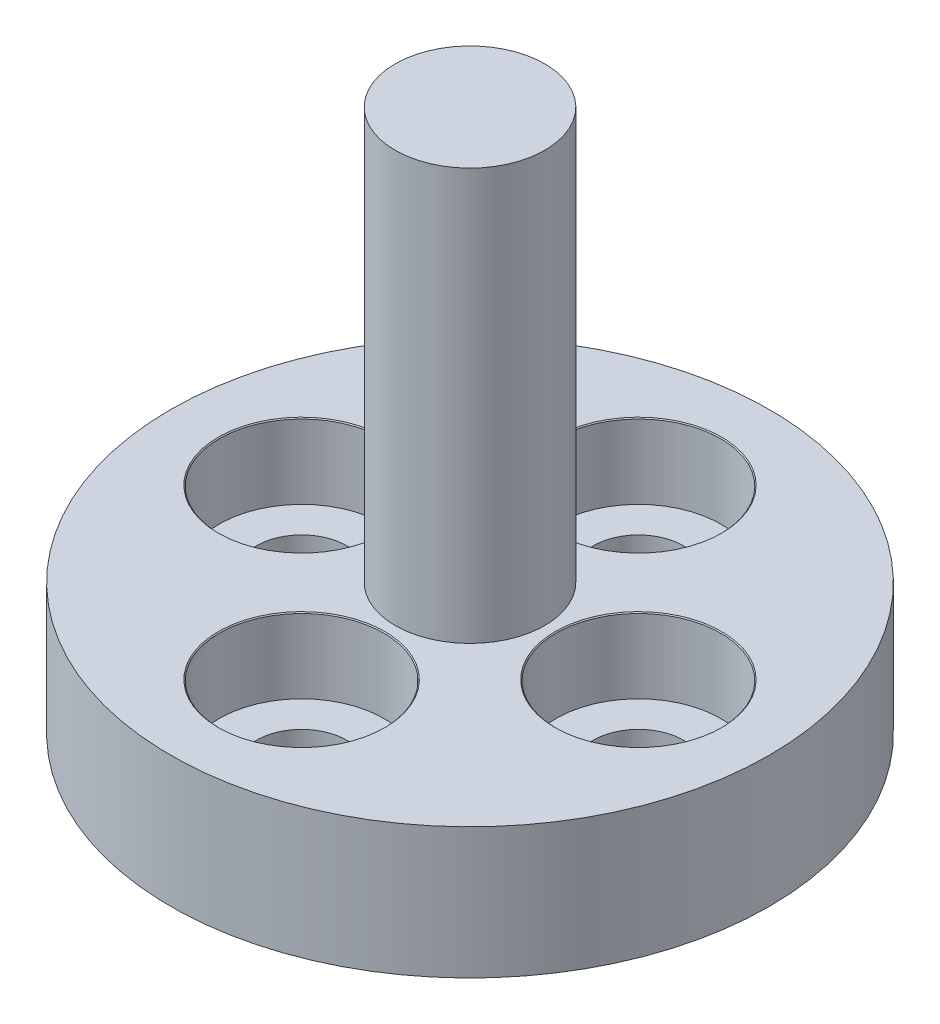
ISO-10303-21;
HEADER;
FILE_DESCRIPTION(('STEP AP214'),'2;1');
FILE_NAME('part.step','',(''),(''),'','','');
FILE_SCHEMA(('AUTOMOTIVE_DESIGN { 1 0 10303 214 1 1 1 1 }'));
ENDSEC;
DATA;
#1=APPLICATION_CONTEXT('core data for automotive mechanical design processes');
#2=APPLICATION_PROTOCOL_DEFINITION('international standard','automotive_design',2000,#1);
#3=PRODUCT_CONTEXT('',#1,'mechanical');
#4=PRODUCT('Part','Part','',(#3));
#5=PRODUCT_RELATED_PRODUCT_CATEGORY('part','',(#4));
#6=PRODUCT_DEFINITION_FORMATION('','',#4);
#7=PRODUCT_DEFINITION_CONTEXT('part definition',#1,'design');
#8=PRODUCT_DEFINITION('design','',#6,#7);
#9=PRODUCT_DEFINITION_SHAPE('','',#8);
#10=(LENGTH_UNIT() NAMED_UNIT(*) SI_UNIT(.MILLI.,.METRE.));
#11=(NAMED_UNIT(*) PLANE_ANGLE_UNIT() SI_UNIT($,.RADIAN.));
#12=(NAMED_UNIT(*) SI_UNIT($,.STERADIAN.) SOLID_ANGLE_UNIT());
#13=UNCERTAINTY_MEASURE_WITH_UNIT(LENGTH_MEASURE(1.E-05),#10,'distance_accuracy_value','');
#14=(GEOMETRIC_REPRESENTATION_CONTEXT(3) GLOBAL_UNCERTAINTY_ASSIGNED_CONTEXT((#13)) GLOBAL_UNIT_ASSIGNED_CONTEXT((#10,
#11,#12)) REPRESENTATION_CONTEXT('',''));
#15=CARTESIAN_POINT('',(0.,0.,0.));
#16=DIRECTION('',(0.,0.,1.));
#17=DIRECTION('',(1.,0.,0.));
#18=AXIS2_PLACEMENT_3D('',#15,#16,#17);
#19=CARTESIAN_POINT('',(0.,0.,0.));
#20=DIRECTION('',(0.,1.,0.));
#21=DIRECTION('',(-1.,0.,0.));
#22=AXIS2_PLACEMENT_3D('',#19,#20,#21);
#23=PLANE('',#22);
#24=CARTESIAN_POINT('',(-4.5,0.,0.));
#25=DIRECTION('',(0.,1.,0.));
#26=DIRECTION('',(0.,0.,1.));
#27=AXIS2_PLACEMENT_3D('',#24,#25,#26);
#28=CIRCLE('',#27,1.2);
#29=CARTESIAN_POINT('',(-4.5,0.,1.2));
#30=VERTEX_POINT('',#29);
#31=EDGE_CURVE('E101',#30,#30,#28,.T.);
#32=ORIENTED_EDGE('',*,*,#31,.T.);
#33=EDGE_LOOP('',(#32));
#34=FACE_BOUND('',#33,.T.);
#35=CARTESIAN_POINT('',(0.,0.,-4.5));
#36=DIRECTION('',(0.,1.,0.));
#37=DIRECTION('',(0.,0.,1.));
#38=AXIS2_PLACEMENT_3D('',#35,#36,#37);
#39=CIRCLE('',#38,1.2);
#40=CARTESIAN_POINT('',(0.,0.,-3.3));
#41=VERTEX_POINT('',#40);
#42=EDGE_CURVE('E86',#41,#41,#39,.T.);
#43=ORIENTED_EDGE('',*,*,#42,.T.);
#44=EDGE_LOOP('',(#43));
#45=FACE_BOUND('',#44,.T.);
#46=CARTESIAN_POINT('',(4.5,0.,0.));
#47=DIRECTION('',(0.,1.,0.));
#48=DIRECTION('',(0.,0.,1.));
#49=AXIS2_PLACEMENT_3D('',#46,#47,#48);
#50=CIRCLE('',#49,1.2);
#51=CARTESIAN_POINT('',(4.5,0.,1.2));
#52=VERTEX_POINT('',#51);
#53=EDGE_CURVE('E71',#52,#52,#50,.T.);
#54=ORIENTED_EDGE('',*,*,#53,.T.);
#55=EDGE_LOOP('',(#54));
#56=FACE_BOUND('',#55,.T.);
#57=CARTESIAN_POINT('',(0.,0.,4.5));
#58=DIRECTION('',(0.,1.,0.));
#59=DIRECTION('',(0.,0.,1.));
#60=AXIS2_PLACEMENT_3D('',#57,#58,#59);
#61=CIRCLE('',#60,1.2);
#62=CARTESIAN_POINT('',(0.,0.,5.7));
#63=VERTEX_POINT('',#62);
#64=EDGE_CURVE('E56',#63,#63,#61,.T.);
#65=ORIENTED_EDGE('',*,*,#64,.T.);
#66=EDGE_LOOP('',(#65));
#67=FACE_BOUND('',#66,.T.);
#68=CARTESIAN_POINT('',(0.,0.,0.));
#69=DIRECTION('',(0.,1.,0.));
#70=DIRECTION('',(-1.,0.,0.));
#71=AXIS2_PLACEMENT_3D('',#68,#69,#70);
#72=CIRCLE('',#71,8.);
#73=CARTESIAN_POINT('',(-8.,0.,0.));
#74=VERTEX_POINT('',#73);
#75=EDGE_CURVE('E10',#74,#74,#72,.T.);
#76=ORIENTED_EDGE('',*,*,#75,.F.);
#77=EDGE_LOOP('',(#76));
#78=FACE_BOUND('',#77,.T.);
#79=ADVANCED_FACE('F37',(#34,#45,#56,#67,#78),#23,.F.);
#80=CARTESIAN_POINT('',(0.,14.5,0.));
#81=DIRECTION('',(0.,1.,0.));
#82=DIRECTION('',(-1.,0.,0.));
#83=AXIS2_PLACEMENT_3D('',#80,#81,#82);
#84=CYLINDRICAL_SURFACE('',#83,8.);
#85=CARTESIAN_POINT('',(0.,3.5,0.));
#86=DIRECTION('',(0.,1.,0.));
#87=DIRECTION('',(-1.,0.,0.));
#88=AXIS2_PLACEMENT_3D('',#85,#86,#87);
#89=CIRCLE('',#88,8.);
#90=CARTESIAN_POINT('',(-8.,3.5,0.));
#91=VERTEX_POINT('',#90);
#92=EDGE_CURVE('E43',#91,#91,#89,.T.);
#93=ORIENTED_EDGE('',*,*,#92,.F.);
#94=EDGE_LOOP('',(#93));
#95=FACE_BOUND('',#94,.T.);
#96=ORIENTED_EDGE('',*,*,#75,.T.);
#97=EDGE_LOOP('',(#96));
#98=FACE_BOUND('',#97,.T.);
#99=ADVANCED_FACE('F123',(#95,#98),#84,.T.);
#100=CARTESIAN_POINT('',(8.,3.5,0.));
#101=DIRECTION('',(0.,-1.,0.));
#102=DIRECTION('',(1.,0.,0.));
#103=AXIS2_PLACEMENT_3D('',#100,#101,#102);
#104=PLANE('',#103);
#105=CARTESIAN_POINT('',(-4.5,3.5,0.));
#106=DIRECTION('',(0.,1.,0.));
#107=DIRECTION('',(0.,0.,1.));
#108=AXIS2_PLACEMENT_3D('',#105,#106,#107);
#109=CIRCLE('',#108,2.225);
#110=CARTESIAN_POINT('',(-4.5,3.5,2.225));
#111=VERTEX_POINT('',#110);
#112=EDGE_CURVE('E113',#111,#111,#109,.T.);
#113=ORIENTED_EDGE('',*,*,#112,.F.);
#114=EDGE_LOOP('',(#113));
#115=FACE_BOUND('',#114,.T.);
#116=CARTESIAN_POINT('',(0.,3.5,-4.5));
#117=DIRECTION('',(0.,1.,0.));
#118=DIRECTION('',(0.,0.,1.));
#119=AXIS2_PLACEMENT_3D('',#116,#117,#118);
#120=CIRCLE('',#119,2.225);
#121=CARTESIAN_POINT('',(0.,3.5,-2.275));
#122=VERTEX_POINT('',#121);
#123=EDGE_CURVE('E98',#122,#122,#120,.T.);
#124=ORIENTED_EDGE('',*,*,#123,.F.);
#125=EDGE_LOOP('',(#124));
#126=FACE_BOUND('',#125,.T.);
#127=CARTESIAN_POINT('',(4.5,3.5,0.));
#128=DIRECTION('',(0.,1.,0.));
#129=DIRECTION('',(0.,0.,1.));
#130=AXIS2_PLACEMENT_3D('',#127,#128,#129);
#131=CIRCLE('',#130,2.225);
#132=CARTESIAN_POINT('',(4.5,3.5,2.225));
#133=VERTEX_POINT('',#132);
#134=EDGE_CURVE('E83',#133,#133,#131,.T.);
#135=ORIENTED_EDGE('',*,*,#134,.F.);
#136=EDGE_LOOP('',(#135));
#137=FACE_BOUND('',#136,.T.);
#138=CARTESIAN_POINT('',(0.,3.5,4.5));
#139=DIRECTION('',(0.,1.,0.));
#140=DIRECTION('',(0.,0.,1.));
#141=AXIS2_PLACEMENT_3D('',#138,#139,#140);
#142=CIRCLE('',#141,2.225);
#143=CARTESIAN_POINT('',(0.,3.5,6.725));
#144=VERTEX_POINT('',#143);
#145=EDGE_CURVE('E68',#144,#144,#142,.T.);
#146=ORIENTED_EDGE('',*,*,#145,.F.);
#147=EDGE_LOOP('',(#146));
#148=FACE_BOUND('',#147,.T.);
#149=CARTESIAN_POINT('',(0.,3.5,0.));
#150=DIRECTION('',(0.,1.,0.));
#151=DIRECTION('',(-1.,0.,0.));
#152=AXIS2_PLACEMENT_3D('',#149,#150,#151);
#153=CIRCLE('',#152,2.);
#154=CARTESIAN_POINT('',(-2.,3.5,0.));
#155=VERTEX_POINT('',#154);
#156=EDGE_CURVE('E47',#155,#155,#153,.T.);
#157=ORIENTED_EDGE('',*,*,#156,.F.);
#158=EDGE_LOOP('',(#157));
#159=FACE_BOUND('',#158,.T.);
#160=ORIENTED_EDGE('',*,*,#92,.T.);
#161=EDGE_LOOP('',(#160));
#162=FACE_BOUND('',#161,.T.);
#163=ADVANCED_FACE('F119',(#115,#126,#137,#148,#159,#162),#104,.F.);
#164=CARTESIAN_POINT('',(0.,14.5,0.));
#165=DIRECTION('',(0.,1.,0.));
#166=DIRECTION('',(-1.,0.,0.));
#167=AXIS2_PLACEMENT_3D('',#164,#165,#166);
#168=CYLINDRICAL_SURFACE('',#167,2.);
#169=CARTESIAN_POINT('',(0.,14.5,0.));
#170=DIRECTION('',(0.,1.,0.));
#171=DIRECTION('',(-1.,0.,0.));
#172=AXIS2_PLACEMENT_3D('',#169,#170,#171);
#173=CIRCLE('',#172,2.);
#174=CARTESIAN_POINT('',(-2.,14.5,0.));
#175=VERTEX_POINT('',#174);
#176=EDGE_CURVE('E51',#175,#175,#173,.T.);
#177=ORIENTED_EDGE('',*,*,#176,.F.);
#178=EDGE_LOOP('',(#177));
#179=FACE_BOUND('',#178,.T.);
#180=ORIENTED_EDGE('',*,*,#156,.T.);
#181=EDGE_LOOP('',(#180));
#182=FACE_BOUND('',#181,.T.);
#183=ADVANCED_FACE('F122',(#179,#182),#168,.T.);
#184=CARTESIAN_POINT('',(2.,14.5,0.));
#185=DIRECTION('',(0.,-1.,0.));
#186=DIRECTION('',(1.,0.,0.));
#187=AXIS2_PLACEMENT_3D('',#184,#185,#186);
#188=PLANE('',#187);
#189=ORIENTED_EDGE('',*,*,#176,.T.);
#190=EDGE_LOOP('',(#189));
#191=FACE_BOUND('',#190,.T.);
#192=ADVANCED_FACE('F134',(#191),#188,.F.);
#193=CARTESIAN_POINT('',(0.,3.5,4.5));
#194=DIRECTION('',(0.,1.,0.));
#195=DIRECTION('',(0.,0.,1.));
#196=AXIS2_PLACEMENT_3D('',#193,#194,#195);
#197=CYLINDRICAL_SURFACE('',#196,1.2);
#198=ORIENTED_EDGE('',*,*,#64,.F.);
#199=EDGE_LOOP('',(#198));
#200=FACE_BOUND('',#199,.T.);
#201=CARTESIAN_POINT('',(0.,1.5,4.5));
#202=DIRECTION('',(0.,1.,0.));
#203=DIRECTION('',(0.,0.,1.));
#204=AXIS2_PLACEMENT_3D('',#201,#202,#203);
#205=CIRCLE('',#204,1.2);
#206=CARTESIAN_POINT('',(0.,1.5,5.7));
#207=VERTEX_POINT('',#206);
#208=EDGE_CURVE('E59',#207,#207,#205,.T.);
#209=ORIENTED_EDGE('',*,*,#208,.T.);
#210=EDGE_LOOP('',(#209));
#211=FACE_BOUND('',#210,.T.);
#212=ADVANCED_FACE('F141',(#200,#211),#197,.F.);
#213=CARTESIAN_POINT('',(2.2,1.5,4.5));
#214=DIRECTION('',(0.,-1.,0.));
#215=DIRECTION('',(0.,0.,-1.));
#216=AXIS2_PLACEMENT_3D('',#213,#214,#215);
#217=PLANE('',#216);
#218=ORIENTED_EDGE('',*,*,#208,.F.);
#219=EDGE_LOOP('',(#218));
#220=FACE_BOUND('',#219,.T.);
#221=CARTESIAN_POINT('',(0.,1.5,4.5));
#222=DIRECTION('',(0.,1.,0.));
#223=DIRECTION('',(0.,0.,1.));
#224=AXIS2_PLACEMENT_3D('',#221,#222,#223);
#225=CIRCLE('',#224,2.2);
#226=CARTESIAN_POINT('',(0.,1.5,6.7));
#227=VERTEX_POINT('',#226);
#228=EDGE_CURVE('E62',#227,#227,#225,.T.);
#229=ORIENTED_EDGE('',*,*,#228,.T.);
#230=EDGE_LOOP('',(#229));
#231=FACE_BOUND('',#230,.T.);
#232=ADVANCED_FACE('F161',(#220,#231),#217,.F.);
#233=CARTESIAN_POINT('',(0.,3.5,4.5));
#234=DIRECTION('',(0.,1.,0.));
#235=DIRECTION('',(0.,0.,1.));
#236=AXIS2_PLACEMENT_3D('',#233,#234,#235);
#237=CYLINDRICAL_SURFACE('',#236,2.2);
#238=ORIENTED_EDGE('',*,*,#228,.F.);
#239=EDGE_LOOP('',(#238));
#240=FACE_BOUND('',#239,.T.);
#241=CARTESIAN_POINT('',(0.,3.475,4.5));
#242=DIRECTION('',(0.,1.,0.));
#243=DIRECTION('',(0.,0.,1.));
#244=AXIS2_PLACEMENT_3D('',#241,#242,#243);
#245=CIRCLE('',#244,2.2);
#246=CARTESIAN_POINT('',(0.,3.475,6.7));
#247=VERTEX_POINT('',#246);
#248=EDGE_CURVE('E65',#247,#247,#245,.T.);
#249=ORIENTED_EDGE('',*,*,#248,.T.);
#250=EDGE_LOOP('',(#249));
#251=FACE_BOUND('',#250,.T.);
#252=ADVANCED_FACE('F167',(#240,#251),#237,.F.);
#253=CARTESIAN_POINT('',(0.,3.5,4.5));
#254=DIRECTION('',(0.,1.,0.));
#255=DIRECTION('',(0.,0.,1.));
#256=AXIS2_PLACEMENT_3D('',#253,#254,#255);
#257=CONICAL_SURFACE('',#256,2.225,0.785398163397457);
#258=ORIENTED_EDGE('',*,*,#248,.F.);
#259=EDGE_LOOP('',(#258));
#260=FACE_BOUND('',#259,.T.);
#261=ORIENTED_EDGE('',*,*,#145,.T.);
#262=EDGE_LOOP('',(#261));
#263=FACE_BOUND('',#262,.T.);
#264=ADVANCED_FACE('F173',(#260,#263),#257,.F.);
#265=CARTESIAN_POINT('',(4.5,3.5,0.));
#266=DIRECTION('',(0.,1.,0.));
#267=DIRECTION('',(0.,0.,1.));
#268=AXIS2_PLACEMENT_3D('',#265,#266,#267);
#269=CYLINDRICAL_SURFACE('',#268,1.2);
#270=ORIENTED_EDGE('',*,*,#53,.F.);
#271=EDGE_LOOP('',(#270));
#272=FACE_BOUND('',#271,.T.);
#273=CARTESIAN_POINT('',(4.5,1.5,0.));
#274=DIRECTION('',(0.,1.,0.));
#275=DIRECTION('',(0.,0.,1.));
#276=AXIS2_PLACEMENT_3D('',#273,#274,#275);
#277=CIRCLE('',#276,1.2);
#278=CARTESIAN_POINT('',(4.5,1.5,1.2));
#279=VERTEX_POINT('',#278);
#280=EDGE_CURVE('E74',#279,#279,#277,.T.);
#281=ORIENTED_EDGE('',*,*,#280,.T.);
#282=EDGE_LOOP('',(#281));
#283=FACE_BOUND('',#282,.T.);
#284=ADVANCED_FACE('F179',(#272,#283),#269,.F.);
#285=CARTESIAN_POINT('',(6.7,1.5,0.));
#286=DIRECTION('',(0.,-1.,0.));
#287=DIRECTION('',(0.,0.,-1.));
#288=AXIS2_PLACEMENT_3D('',#285,#286,#287);
#289=PLANE('',#288);
#290=ORIENTED_EDGE('',*,*,#280,.F.);
#291=EDGE_LOOP('',(#290));
#292=FACE_BOUND('',#291,.T.);
#293=CARTESIAN_POINT('',(4.5,1.5,0.));
#294=DIRECTION('',(0.,1.,0.));
#295=DIRECTION('',(0.,0.,1.));
#296=AXIS2_PLACEMENT_3D('',#293,#294,#295);
#297=CIRCLE('',#296,2.2);
#298=CARTESIAN_POINT('',(4.5,1.5,2.2));
#299=VERTEX_POINT('',#298);
#300=EDGE_CURVE('E77',#299,#299,#297,.T.);
#301=ORIENTED_EDGE('',*,*,#300,.T.);
#302=EDGE_LOOP('',(#301));
#303=FACE_BOUND('',#302,.T.);
#304=ADVANCED_FACE('F184',(#292,#303),#289,.F.);
#305=CARTESIAN_POINT('',(4.5,3.5,0.));
#306=DIRECTION('',(0.,1.,0.));
#307=DIRECTION('',(0.,0.,1.));
#308=AXIS2_PLACEMENT_3D('',#305,#306,#307);
#309=CYLINDRICAL_SURFACE('',#308,2.2);
#310=ORIENTED_EDGE('',*,*,#300,.F.);
#311=EDGE_LOOP('',(#310));
#312=FACE_BOUND('',#311,.T.);
#313=CARTESIAN_POINT('',(4.5,3.475,0.));
#314=DIRECTION('',(0.,1.,0.));
#315=DIRECTION('',(0.,0.,1.));
#316=AXIS2_PLACEMENT_3D('',#313,#314,#315);
#317=CIRCLE('',#316,2.2);
#318=CARTESIAN_POINT('',(4.5,3.475,2.2));
#319=VERTEX_POINT('',#318);
#320=EDGE_CURVE('E80',#319,#319,#317,.T.);
#321=ORIENTED_EDGE('',*,*,#320,.T.);
#322=EDGE_LOOP('',(#321));
#323=FACE_BOUND('',#322,.T.);
#324=ADVANCED_FACE('F190',(#312,#323),#309,.F.);
#325=CARTESIAN_POINT('',(4.5,3.5,0.));
#326=DIRECTION('',(0.,1.,0.));
#327=DIRECTION('',(0.,0.,1.));
#328=AXIS2_PLACEMENT_3D('',#325,#326,#327);
#329=CONICAL_SURFACE('',#328,2.225,0.785398163397448);
#330=ORIENTED_EDGE('',*,*,#320,.F.);
#331=EDGE_LOOP('',(#330));
#332=FACE_BOUND('',#331,.T.);
#333=ORIENTED_EDGE('',*,*,#134,.T.);
#334=EDGE_LOOP('',(#333));
#335=FACE_BOUND('',#334,.T.);
#336=ADVANCED_FACE('F194',(#332,#335),#329,.F.);
#337=CARTESIAN_POINT('',(0.,3.5,-4.5));
#338=DIRECTION('',(0.,1.,0.));
#339=DIRECTION('',(0.,0.,1.));
#340=AXIS2_PLACEMENT_3D('',#337,#338,#339);
#341=CYLINDRICAL_SURFACE('',#340,1.2);
#342=ORIENTED_EDGE('',*,*,#42,.F.);
#343=EDGE_LOOP('',(#342));
#344=FACE_BOUND('',#343,.T.);
#345=CARTESIAN_POINT('',(0.,1.5,-4.5));
#346=DIRECTION('',(0.,1.,0.));
#347=DIRECTION('',(0.,0.,1.));
#348=AXIS2_PLACEMENT_3D('',#345,#346,#347);
#349=CIRCLE('',#348,1.2);
#350=CARTESIAN_POINT('',(0.,1.5,-3.3));
#351=VERTEX_POINT('',#350);
#352=EDGE_CURVE('E89',#351,#351,#349,.T.);
#353=ORIENTED_EDGE('',*,*,#352,.T.);
#354=EDGE_LOOP('',(#353));
#355=FACE_BOUND('',#354,.T.);
#356=ADVANCED_FACE('F198',(#344,#355),#341,.F.);
#357=CARTESIAN_POINT('',(2.2,1.5,-4.5));
#358=DIRECTION('',(0.,-1.,0.));
#359=DIRECTION('',(0.,0.,-1.));
#360=AXIS2_PLACEMENT_3D('',#357,#358,#359);
#361=PLANE('',#360);
#362=ORIENTED_EDGE('',*,*,#352,.F.);
#363=EDGE_LOOP('',(#362));
#364=FACE_BOUND('',#363,.T.);
#365=CARTESIAN_POINT('',(0.,1.5,-4.5));
#366=DIRECTION('',(0.,1.,0.));
#367=DIRECTION('',(0.,0.,1.));
#368=AXIS2_PLACEMENT_3D('',#365,#366,#367);
#369=CIRCLE('',#368,2.2);
#370=CARTESIAN_POINT('',(0.,1.5,-2.3));
#371=VERTEX_POINT('',#370);
#372=EDGE_CURVE('E92',#371,#371,#369,.T.);
#373=ORIENTED_EDGE('',*,*,#372,.T.);
#374=EDGE_LOOP('',(#373));
#375=FACE_BOUND('',#374,.T.);
#376=ADVANCED_FACE('F202',(#364,#375),#361,.F.);
#377=CARTESIAN_POINT('',(0.,3.5,-4.5));
#378=DIRECTION('',(0.,1.,0.));
#379=DIRECTION('',(0.,0.,1.));
#380=AXIS2_PLACEMENT_3D('',#377,#378,#379);
#381=CYLINDRICAL_SURFACE('',#380,2.2);
#382=ORIENTED_EDGE('',*,*,#372,.F.);
#383=EDGE_LOOP('',(#382));
#384=FACE_BOUND('',#383,.T.);
#385=CARTESIAN_POINT('',(0.,3.475,-4.5));
#386=DIRECTION('',(0.,1.,0.));
#387=DIRECTION('',(0.,0.,1.));
#388=AXIS2_PLACEMENT_3D('',#385,#386,#387);
#389=CIRCLE('',#388,2.2);
#390=CARTESIAN_POINT('',(0.,3.475,-2.3));
#391=VERTEX_POINT('',#390);
#392=EDGE_CURVE('E95',#391,#391,#389,.T.);
#393=ORIENTED_EDGE('',*,*,#392,.T.);
#394=EDGE_LOOP('',(#393));
#395=FACE_BOUND('',#394,.T.);
#396=ADVANCED_FACE('F206',(#384,#395),#381,.F.);
#397=CARTESIAN_POINT('',(0.,3.5,-4.5));
#398=DIRECTION('',(0.,1.,0.));
#399=DIRECTION('',(0.,0.,1.));
#400=AXIS2_PLACEMENT_3D('',#397,#398,#399);
#401=CONICAL_SURFACE('',#400,2.225,0.785398163397457);
#402=ORIENTED_EDGE('',*,*,#392,.F.);
#403=EDGE_LOOP('',(#402));
#404=FACE_BOUND('',#403,.T.);
#405=ORIENTED_EDGE('',*,*,#123,.T.);
#406=EDGE_LOOP('',(#405));
#407=FACE_BOUND('',#406,.T.);
#408=ADVANCED_FACE('F210',(#404,#407),#401,.F.);
#409=CARTESIAN_POINT('',(-4.5,3.5,0.));
#410=DIRECTION('',(0.,1.,0.));
#411=DIRECTION('',(0.,0.,1.));
#412=AXIS2_PLACEMENT_3D('',#409,#410,#411);
#413=CYLINDRICAL_SURFACE('',#412,1.2);
#414=ORIENTED_EDGE('',*,*,#31,.F.);
#415=EDGE_LOOP('',(#414));
#416=FACE_BOUND('',#415,.T.);
#417=CARTESIAN_POINT('',(-4.5,1.5,0.));
#418=DIRECTION('',(0.,1.,0.));
#419=DIRECTION('',(0.,0.,1.));
#420=AXIS2_PLACEMENT_3D('',#417,#418,#419);
#421=CIRCLE('',#420,1.2);
#422=CARTESIAN_POINT('',(-4.5,1.5,1.2));
#423=VERTEX_POINT('',#422);
#424=EDGE_CURVE('E104',#423,#423,#421,.T.);
#425=ORIENTED_EDGE('',*,*,#424,.T.);
#426=EDGE_LOOP('',(#425));
#427=FACE_BOUND('',#426,.T.);
#428=ADVANCED_FACE('F214',(#416,#427),#413,.F.);
#429=CARTESIAN_POINT('',(-2.3,1.5,0.));
#430=DIRECTION('',(0.,-1.,0.));
#431=DIRECTION('',(0.,0.,-1.));
#432=AXIS2_PLACEMENT_3D('',#429,#430,#431);
#433=PLANE('',#432);
#434=ORIENTED_EDGE('',*,*,#424,.F.);
#435=EDGE_LOOP('',(#434));
#436=FACE_BOUND('',#435,.T.);
#437=CARTESIAN_POINT('',(-4.5,1.5,0.));
#438=DIRECTION('',(0.,1.,0.));
#439=DIRECTION('',(0.,0.,1.));
#440=AXIS2_PLACEMENT_3D('',#437,#438,#439);
#441=CIRCLE('',#440,2.2);
#442=CARTESIAN_POINT('',(-4.5,1.5,2.2));
#443=VERTEX_POINT('',#442);
#444=EDGE_CURVE('E107',#443,#443,#441,.T.);
#445=ORIENTED_EDGE('',*,*,#444,.T.);
#446=EDGE_LOOP('',(#445));
#447=FACE_BOUND('',#446,.T.);
#448=ADVANCED_FACE('F218',(#436,#447),#433,.F.);
#449=CARTESIAN_POINT('',(-4.5,3.5,0.));
#450=DIRECTION('',(0.,1.,0.));
#451=DIRECTION('',(0.,0.,1.));
#452=AXIS2_PLACEMENT_3D('',#449,#450,#451);
#453=CYLINDRICAL_SURFACE('',#452,2.2);
#454=ORIENTED_EDGE('',*,*,#444,.F.);
#455=EDGE_LOOP('',(#454));
#456=FACE_BOUND('',#455,.T.);
#457=CARTESIAN_POINT('',(-4.5,3.475,0.));
#458=DIRECTION('',(0.,1.,0.));
#459=DIRECTION('',(0.,0.,1.));
#460=AXIS2_PLACEMENT_3D('',#457,#458,#459);
#461=CIRCLE('',#460,2.2);
#462=CARTESIAN_POINT('',(-4.5,3.475,2.2));
#463=VERTEX_POINT('',#462);
#464=EDGE_CURVE('E110',#463,#463,#461,.T.);
#465=ORIENTED_EDGE('',*,*,#464,.T.);
#466=EDGE_LOOP('',(#465));
#467=FACE_BOUND('',#466,.T.);
#468=ADVANCED_FACE('F222',(#456,#467),#453,.F.);
#469=CARTESIAN_POINT('',(-4.5,3.5,0.));
#470=DIRECTION('',(0.,1.,0.));
#471=DIRECTION('',(0.,0.,1.));
#472=AXIS2_PLACEMENT_3D('',#469,#470,#471);
#473=CONICAL_SURFACE('',#472,2.225,0.785398163397448);
#474=ORIENTED_EDGE('',*,*,#464,.F.);
#475=EDGE_LOOP('',(#474));
#476=FACE_BOUND('',#475,.T.);
#477=ORIENTED_EDGE('',*,*,#112,.T.);
#478=EDGE_LOOP('',(#477));
#479=FACE_BOUND('',#478,.T.);
#480=ADVANCED_FACE('F117',(#476,#479),#473,.F.);
#481=CLOSED_SHELL('',(#79,#99,#163,#183,#192,#212,#232,#252,#264,#284,#304,#324,#336,#356,#376,
#396,#408,#428,#448,#468,#480));
#482=MANIFOLD_SOLID_BREP('B2',#481);
#483=ADVANCED_BREP_SHAPE_REPRESENTATION('',(#18,#482),#14);
#484=SHAPE_DEFINITION_REPRESENTATION(#9,#483);
ENDSEC;
END-ISO-10303-21;
